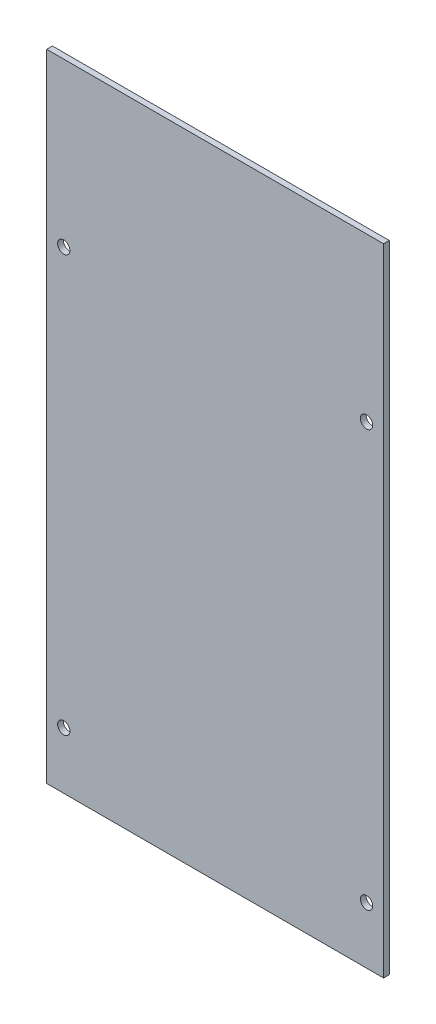
ISO-10303-21;
HEADER;
FILE_DESCRIPTION(('STEP AP214'),'2;1');
FILE_NAME('part.step','',(''),(''),'','','');
FILE_SCHEMA(('AUTOMOTIVE_DESIGN { 1 0 10303 214 1 1 1 1 }'));
ENDSEC;
DATA;
#1=APPLICATION_CONTEXT('core data for automotive mechanical design processes');
#2=APPLICATION_PROTOCOL_DEFINITION('international standard','automotive_design',2000,#1);
#3=PRODUCT_CONTEXT('',#1,'mechanical');
#4=PRODUCT('Part','Part','',(#3));
#5=PRODUCT_RELATED_PRODUCT_CATEGORY('part','',(#4));
#6=PRODUCT_DEFINITION_FORMATION('','',#4);
#7=PRODUCT_DEFINITION_CONTEXT('part definition',#1,'design');
#8=PRODUCT_DEFINITION('design','',#6,#7);
#9=PRODUCT_DEFINITION_SHAPE('','',#8);
#10=(LENGTH_UNIT() NAMED_UNIT(*) SI_UNIT(.MILLI.,.METRE.));
#11=(NAMED_UNIT(*) PLANE_ANGLE_UNIT() SI_UNIT($,.RADIAN.));
#12=(NAMED_UNIT(*) SI_UNIT($,.STERADIAN.) SOLID_ANGLE_UNIT());
#13=UNCERTAINTY_MEASURE_WITH_UNIT(LENGTH_MEASURE(1.E-05),#10,'distance_accuracy_value','');
#14=(GEOMETRIC_REPRESENTATION_CONTEXT(3) GLOBAL_UNCERTAINTY_ASSIGNED_CONTEXT((#13)) GLOBAL_UNIT_ASSIGNED_CONTEXT((#10,
#11,#12)) REPRESENTATION_CONTEXT('',''));
#15=CARTESIAN_POINT('',(0.,0.,0.));
#16=DIRECTION('',(0.,0.,1.));
#17=DIRECTION('',(1.,0.,0.));
#18=AXIS2_PLACEMENT_3D('',#15,#16,#17);
#19=CARTESIAN_POINT('',(-89.,0.,3.));
#20=DIRECTION('',(1.,0.,0.));
#21=DIRECTION('',(0.,0.,-1.));
#22=AXIS2_PLACEMENT_3D('',#19,#20,#21);
#23=PLANE('',#22);
#24=DIRECTION('',(0.,-1.,0.));
#25=VECTOR('',#24,1.);
#26=CARTESIAN_POINT('',(-89.,0.,0.));
#27=LINE('',#26,#25);
#28=CARTESIAN_POINT('',(-89.,336.,0.));
#29=VERTEX_POINT('',#28);
#30=CARTESIAN_POINT('',(-89.,0.,0.));
#31=VERTEX_POINT('',#30);
#32=EDGE_CURVE('E100',#29,#31,#27,.T.);
#33=ORIENTED_EDGE('',*,*,#32,.T.);
#34=DIRECTION('',(0.,0.,-1.));
#35=VECTOR('',#34,1.);
#36=CARTESIAN_POINT('',(-89.,0.,3.));
#37=LINE('',#36,#35);
#38=CARTESIAN_POINT('',(-89.,0.,3.));
#39=VERTEX_POINT('',#38);
#40=EDGE_CURVE('E11',#39,#31,#37,.T.);
#41=ORIENTED_EDGE('',*,*,#40,.F.);
#42=DIRECTION('',(0.,-1.,0.));
#43=VECTOR('',#42,1.);
#44=CARTESIAN_POINT('',(-89.,0.,3.));
#45=LINE('',#44,#43);
#46=CARTESIAN_POINT('',(-89.,336.,3.));
#47=VERTEX_POINT('',#46);
#48=EDGE_CURVE('E88',#47,#39,#45,.T.);
#49=ORIENTED_EDGE('',*,*,#48,.F.);
#50=DIRECTION('',(0.,0.,-1.));
#51=VECTOR('',#50,1.);
#52=CARTESIAN_POINT('',(-89.,336.,3.));
#53=LINE('',#52,#51);
#54=EDGE_CURVE('E96',#47,#29,#53,.T.);
#55=ORIENTED_EDGE('',*,*,#54,.T.);
#56=EDGE_LOOP('',(#33,#41,#49,#55));
#57=FACE_BOUND('',#56,.T.);
#58=ADVANCED_FACE('F37',(#57),#23,.F.);
#59=CARTESIAN_POINT('',(-89.,0.,3.));
#60=DIRECTION('',(0.,1.,0.));
#61=DIRECTION('',(-1.,0.,0.));
#62=AXIS2_PLACEMENT_3D('',#59,#60,#61);
#63=PLANE('',#62);
#64=DIRECTION('',(1.,0.,0.));
#65=VECTOR('',#64,1.);
#66=CARTESIAN_POINT('',(-89.,0.,0.));
#67=LINE('',#66,#65);
#68=CARTESIAN_POINT('',(89.,0.,0.));
#69=VERTEX_POINT('',#68);
#70=EDGE_CURVE('E92',#31,#69,#67,.T.);
#71=ORIENTED_EDGE('',*,*,#70,.T.);
#72=DIRECTION('',(0.,0.,-1.));
#73=VECTOR('',#72,1.);
#74=CARTESIAN_POINT('',(89.,0.,3.));
#75=LINE('',#74,#73);
#76=CARTESIAN_POINT('',(89.,0.,3.));
#77=VERTEX_POINT('',#76);
#78=EDGE_CURVE('E45',#77,#69,#75,.T.);
#79=ORIENTED_EDGE('',*,*,#78,.F.);
#80=DIRECTION('',(1.,0.,0.));
#81=VECTOR('',#80,1.);
#82=CARTESIAN_POINT('',(-89.,0.,3.));
#83=LINE('',#82,#81);
#84=EDGE_CURVE('E83',#39,#77,#83,.T.);
#85=ORIENTED_EDGE('',*,*,#84,.F.);
#86=ORIENTED_EDGE('',*,*,#40,.T.);
#87=EDGE_LOOP('',(#71,#79,#85,#86));
#88=FACE_BOUND('',#87,.T.);
#89=ADVANCED_FACE('F91',(#88),#63,.F.);
#90=CARTESIAN_POINT('',(89.,0.,3.));
#91=DIRECTION('',(-1.,0.,0.));
#92=DIRECTION('',(0.,-1.,0.));
#93=AXIS2_PLACEMENT_3D('',#90,#91,#92);
#94=PLANE('',#93);
#95=DIRECTION('',(0.,1.,0.));
#96=VECTOR('',#95,1.);
#97=CARTESIAN_POINT('',(89.,0.,0.));
#98=LINE('',#97,#96);
#99=CARTESIAN_POINT('',(88.9999999999999,336.,0.));
#100=VERTEX_POINT('',#99);
#101=EDGE_CURVE('E70',#69,#100,#98,.T.);
#102=ORIENTED_EDGE('',*,*,#101,.T.);
#103=DIRECTION('',(0.,0.,-1.));
#104=VECTOR('',#103,1.);
#105=CARTESIAN_POINT('',(88.9999999999999,336.,3.));
#106=LINE('',#105,#104);
#107=CARTESIAN_POINT('',(88.9999999999999,336.,3.));
#108=VERTEX_POINT('',#107);
#109=EDGE_CURVE('E93',#108,#100,#106,.T.);
#110=ORIENTED_EDGE('',*,*,#109,.F.);
#111=DIRECTION('',(0.,1.,0.));
#112=VECTOR('',#111,1.);
#113=CARTESIAN_POINT('',(89.,0.,3.));
#114=LINE('',#113,#112);
#115=EDGE_CURVE('E86',#77,#108,#114,.T.);
#116=ORIENTED_EDGE('',*,*,#115,.F.);
#117=ORIENTED_EDGE('',*,*,#78,.T.);
#118=EDGE_LOOP('',(#102,#110,#116,#117));
#119=FACE_BOUND('',#118,.T.);
#120=ADVANCED_FACE('F94',(#119),#94,.F.);
#121=CARTESIAN_POINT('',(-89.,336.,3.));
#122=DIRECTION('',(0.,-1.,0.));
#123=DIRECTION('',(1.,0.,0.));
#124=AXIS2_PLACEMENT_3D('',#121,#122,#123);
#125=PLANE('',#124);
#126=DIRECTION('',(-1.,0.,0.));
#127=VECTOR('',#126,1.);
#128=CARTESIAN_POINT('',(-89.,336.,0.));
#129=LINE('',#128,#127);
#130=EDGE_CURVE('E76',#100,#29,#129,.T.);
#131=ORIENTED_EDGE('',*,*,#130,.T.);
#132=ORIENTED_EDGE('',*,*,#54,.F.);
#133=DIRECTION('',(-1.,0.,0.));
#134=VECTOR('',#133,1.);
#135=CARTESIAN_POINT('',(-89.,336.,3.));
#136=LINE('',#135,#134);
#137=EDGE_CURVE('E53',#108,#47,#136,.T.);
#138=ORIENTED_EDGE('',*,*,#137,.F.);
#139=ORIENTED_EDGE('',*,*,#109,.T.);
#140=EDGE_LOOP('',(#131,#132,#138,#139));
#141=FACE_BOUND('',#140,.T.);
#142=ADVANCED_FACE('F108',(#141),#125,.F.);
#143=CARTESIAN_POINT('',(0.,0.,3.));
#144=DIRECTION('',(0.,0.,-1.));
#145=DIRECTION('',(-1.,0.,0.));
#146=AXIS2_PLACEMENT_3D('',#143,#144,#145);
#147=PLANE('',#146);
#148=CARTESIAN_POINT('',(-79.9999999999999,30.,3.));
#149=DIRECTION('',(0.,0.,1.));
#150=DIRECTION('',(1.,0.,0.));
#151=AXIS2_PLACEMENT_3D('',#148,#149,#150);
#152=CIRCLE('',#151,3.25000000000001);
#153=CARTESIAN_POINT('',(-76.7499999999999,30.,3.));
#154=VERTEX_POINT('',#153);
#155=EDGE_CURVE('E123',#154,#154,#152,.T.);
#156=ORIENTED_EDGE('',*,*,#155,.F.);
#157=EDGE_LOOP('',(#156));
#158=FACE_BOUND('',#157,.T.);
#159=CARTESIAN_POINT('',(80.0000000000001,30.,3.));
#160=DIRECTION('',(0.,0.,1.));
#161=DIRECTION('',(1.,0.,0.));
#162=AXIS2_PLACEMENT_3D('',#159,#160,#161);
#163=CIRCLE('',#162,3.25000000000001);
#164=CARTESIAN_POINT('',(83.2500000000001,30.,3.));
#165=VERTEX_POINT('',#164);
#166=EDGE_CURVE('E129',#165,#165,#163,.T.);
#167=ORIENTED_EDGE('',*,*,#166,.F.);
#168=EDGE_LOOP('',(#167));
#169=FACE_BOUND('',#168,.T.);
#170=CARTESIAN_POINT('',(80.,250.,3.));
#171=DIRECTION('',(0.,0.,1.));
#172=DIRECTION('',(1.,0.,0.));
#173=AXIS2_PLACEMENT_3D('',#170,#171,#172);
#174=CIRCLE('',#173,3.25000000000001);
#175=CARTESIAN_POINT('',(83.25,250.,3.));
#176=VERTEX_POINT('',#175);
#177=EDGE_CURVE('E117',#176,#176,#174,.T.);
#178=ORIENTED_EDGE('',*,*,#177,.F.);
#179=EDGE_LOOP('',(#178));
#180=FACE_BOUND('',#179,.T.);
#181=CARTESIAN_POINT('',(-80.,250.,3.));
#182=DIRECTION('',(0.,0.,1.));
#183=DIRECTION('',(1.,0.,0.));
#184=AXIS2_PLACEMENT_3D('',#181,#182,#183);
#185=CIRCLE('',#184,3.25000000000001);
#186=CARTESIAN_POINT('',(-76.75,250.,3.));
#187=VERTEX_POINT('',#186);
#188=EDGE_CURVE('E114',#187,#187,#185,.T.);
#189=ORIENTED_EDGE('',*,*,#188,.F.);
#190=EDGE_LOOP('',(#189));
#191=FACE_BOUND('',#190,.T.);
#192=ORIENTED_EDGE('',*,*,#48,.T.);
#193=ORIENTED_EDGE('',*,*,#84,.T.);
#194=ORIENTED_EDGE('',*,*,#115,.T.);
#195=ORIENTED_EDGE('',*,*,#137,.T.);
#196=EDGE_LOOP('',(#192,#193,#194,#195));
#197=FACE_BOUND('',#196,.T.);
#198=ADVANCED_FACE('F84',(#158,#169,#180,#191,#197),#147,.F.);
#199=CARTESIAN_POINT('',(0.,0.,0.));
#200=DIRECTION('',(0.,0.,-1.));
#201=DIRECTION('',(-1.,0.,0.));
#202=AXIS2_PLACEMENT_3D('',#199,#200,#201);
#203=PLANE('',#202);
#204=CARTESIAN_POINT('',(-79.9999999999999,30.,0.));
#205=DIRECTION('',(0.,0.,1.));
#206=DIRECTION('',(1.,0.,0.));
#207=AXIS2_PLACEMENT_3D('',#204,#205,#206);
#208=CIRCLE('',#207,3.25000000000001);
#209=CARTESIAN_POINT('',(-76.7499999999999,30.,0.));
#210=VERTEX_POINT('',#209);
#211=EDGE_CURVE('E120',#210,#210,#208,.T.);
#212=ORIENTED_EDGE('',*,*,#211,.T.);
#213=EDGE_LOOP('',(#212));
#214=FACE_BOUND('',#213,.T.);
#215=CARTESIAN_POINT('',(80.0000000000001,30.,0.));
#216=DIRECTION('',(0.,0.,1.));
#217=DIRECTION('',(1.,0.,0.));
#218=AXIS2_PLACEMENT_3D('',#215,#216,#217);
#219=CIRCLE('',#218,3.25000000000001);
#220=CARTESIAN_POINT('',(83.2500000000001,30.,0.));
#221=VERTEX_POINT('',#220);
#222=EDGE_CURVE('E126',#221,#221,#219,.T.);
#223=ORIENTED_EDGE('',*,*,#222,.T.);
#224=EDGE_LOOP('',(#223));
#225=FACE_BOUND('',#224,.T.);
#226=CARTESIAN_POINT('',(80.,250.,0.));
#227=DIRECTION('',(0.,0.,1.));
#228=DIRECTION('',(1.,0.,0.));
#229=AXIS2_PLACEMENT_3D('',#226,#227,#228);
#230=CIRCLE('',#229,3.25000000000001);
#231=CARTESIAN_POINT('',(83.25,250.,0.));
#232=VERTEX_POINT('',#231);
#233=EDGE_CURVE('E132',#232,#232,#230,.T.);
#234=ORIENTED_EDGE('',*,*,#233,.T.);
#235=EDGE_LOOP('',(#234));
#236=FACE_BOUND('',#235,.T.);
#237=CARTESIAN_POINT('',(-80.,250.,0.));
#238=DIRECTION('',(0.,0.,1.));
#239=DIRECTION('',(1.,0.,0.));
#240=AXIS2_PLACEMENT_3D('',#237,#238,#239);
#241=CIRCLE('',#240,3.25000000000001);
#242=CARTESIAN_POINT('',(-76.75,250.,0.));
#243=VERTEX_POINT('',#242);
#244=EDGE_CURVE('E103',#243,#243,#241,.T.);
#245=ORIENTED_EDGE('',*,*,#244,.T.);
#246=EDGE_LOOP('',(#245));
#247=FACE_BOUND('',#246,.T.);
#248=ORIENTED_EDGE('',*,*,#32,.F.);
#249=ORIENTED_EDGE('',*,*,#130,.F.);
#250=ORIENTED_EDGE('',*,*,#101,.F.);
#251=ORIENTED_EDGE('',*,*,#70,.F.);
#252=EDGE_LOOP('',(#248,#249,#250,#251));
#253=FACE_BOUND('',#252,.T.);
#254=ADVANCED_FACE('F111',(#214,#225,#236,#247,#253),#203,.T.);
#255=CARTESIAN_POINT('',(-80.,250.,0.));
#256=DIRECTION('',(0.,0.,1.));
#257=DIRECTION('',(1.,0.,0.));
#258=AXIS2_PLACEMENT_3D('',#255,#256,#257);
#259=CYLINDRICAL_SURFACE('',#258,3.25000000000001);
#260=ORIENTED_EDGE('',*,*,#244,.F.);
#261=EDGE_LOOP('',(#260));
#262=FACE_BOUND('',#261,.T.);
#263=ORIENTED_EDGE('',*,*,#188,.T.);
#264=EDGE_LOOP('',(#263));
#265=FACE_BOUND('',#264,.T.);
#266=ADVANCED_FACE('F146',(#262,#265),#259,.F.);
#267=CARTESIAN_POINT('',(80.,250.,0.));
#268=DIRECTION('',(0.,0.,1.));
#269=DIRECTION('',(1.,0.,0.));
#270=AXIS2_PLACEMENT_3D('',#267,#268,#269);
#271=CYLINDRICAL_SURFACE('',#270,3.25000000000001);
#272=ORIENTED_EDGE('',*,*,#233,.F.);
#273=EDGE_LOOP('',(#272));
#274=FACE_BOUND('',#273,.T.);
#275=ORIENTED_EDGE('',*,*,#177,.T.);
#276=EDGE_LOOP('',(#275));
#277=FACE_BOUND('',#276,.T.);
#278=ADVANCED_FACE('F138',(#274,#277),#271,.F.);
#279=CARTESIAN_POINT('',(80.0000000000001,30.,0.));
#280=DIRECTION('',(0.,0.,1.));
#281=DIRECTION('',(1.,0.,0.));
#282=AXIS2_PLACEMENT_3D('',#279,#280,#281);
#283=CYLINDRICAL_SURFACE('',#282,3.25000000000001);
#284=ORIENTED_EDGE('',*,*,#222,.F.);
#285=EDGE_LOOP('',(#284));
#286=FACE_BOUND('',#285,.T.);
#287=ORIENTED_EDGE('',*,*,#166,.T.);
#288=EDGE_LOOP('',(#287));
#289=FACE_BOUND('',#288,.T.);
#290=ADVANCED_FACE('F154',(#286,#289),#283,.F.);
#291=CARTESIAN_POINT('',(-79.9999999999999,30.,0.));
#292=DIRECTION('',(0.,0.,1.));
#293=DIRECTION('',(1.,0.,0.));
#294=AXIS2_PLACEMENT_3D('',#291,#292,#293);
#295=CYLINDRICAL_SURFACE('',#294,3.25000000000001);
#296=ORIENTED_EDGE('',*,*,#211,.F.);
#297=EDGE_LOOP('',(#296));
#298=FACE_BOUND('',#297,.T.);
#299=ORIENTED_EDGE('',*,*,#155,.T.);
#300=EDGE_LOOP('',(#299));
#301=FACE_BOUND('',#300,.T.);
#302=ADVANCED_FACE('F205',(#298,#301),#295,.F.);
#303=CLOSED_SHELL('',(#58,#89,#120,#142,#198,#254,#266,#278,#290,#302));
#304=MANIFOLD_SOLID_BREP('B2',#303);
#305=ADVANCED_BREP_SHAPE_REPRESENTATION('',(#18,#304),#14);
#306=SHAPE_DEFINITION_REPRESENTATION(#9,#305);
ENDSEC;
END-ISO-10303-21;
